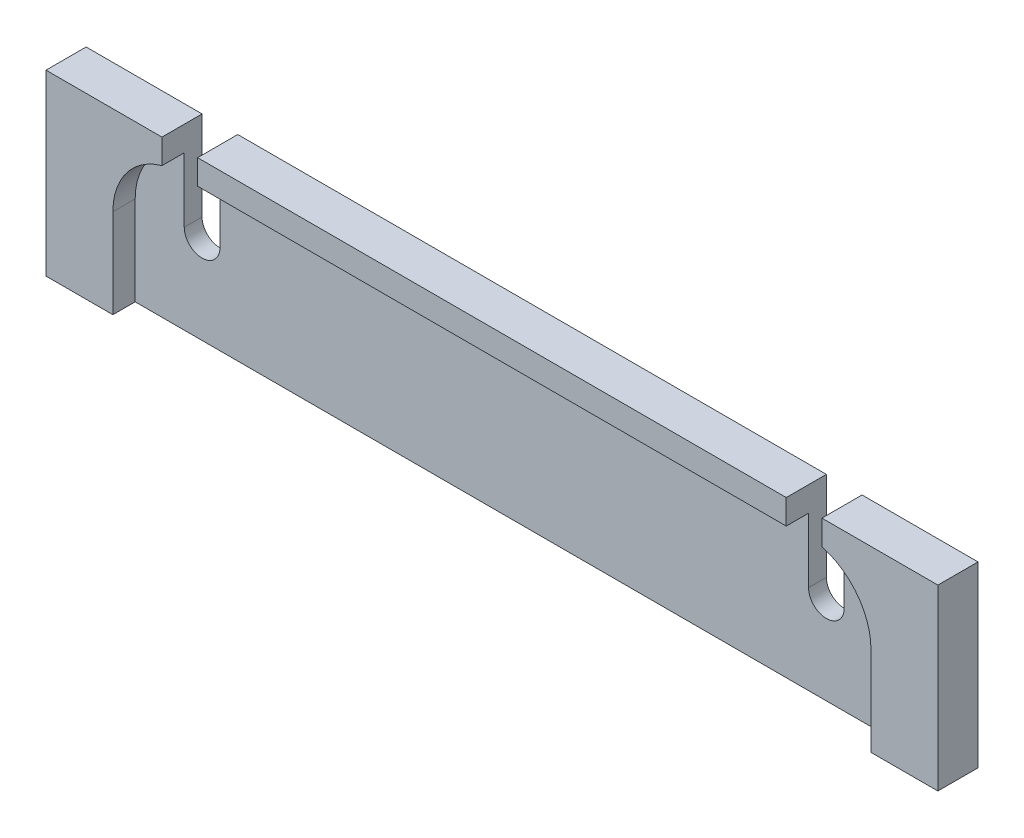
ISO-10303-21;
HEADER;
FILE_DESCRIPTION(('STEP AP214'),'2;1');
FILE_NAME('part.step','',(''),(''),'','','');
FILE_SCHEMA(('AUTOMOTIVE_DESIGN { 1 0 10303 214 1 1 1 1 }'));
ENDSEC;
DATA;
#1=APPLICATION_CONTEXT('core data for automotive mechanical design processes');
#2=APPLICATION_PROTOCOL_DEFINITION('international standard','automotive_design',2000,#1);
#3=PRODUCT_CONTEXT('',#1,'mechanical');
#4=PRODUCT('Part','Part','',(#3));
#5=PRODUCT_RELATED_PRODUCT_CATEGORY('part','',(#4));
#6=PRODUCT_DEFINITION_FORMATION('','',#4);
#7=PRODUCT_DEFINITION_CONTEXT('part definition',#1,'design');
#8=PRODUCT_DEFINITION('design','',#6,#7);
#9=PRODUCT_DEFINITION_SHAPE('','',#8);
#10=(LENGTH_UNIT() NAMED_UNIT(*) SI_UNIT(.MILLI.,.METRE.));
#11=(NAMED_UNIT(*) PLANE_ANGLE_UNIT() SI_UNIT($,.RADIAN.));
#12=(NAMED_UNIT(*) SI_UNIT($,.STERADIAN.) SOLID_ANGLE_UNIT());
#13=UNCERTAINTY_MEASURE_WITH_UNIT(LENGTH_MEASURE(1.E-05),#10,'distance_accuracy_value','');
#14=(GEOMETRIC_REPRESENTATION_CONTEXT(3) GLOBAL_UNCERTAINTY_ASSIGNED_CONTEXT((#13)) GLOBAL_UNIT_ASSIGNED_CONTEXT((#10,
#11,#12)) REPRESENTATION_CONTEXT('',''));
#15=CARTESIAN_POINT('',(0.,0.,0.));
#16=DIRECTION('',(0.,0.,1.));
#17=DIRECTION('',(1.,0.,0.));
#18=AXIS2_PLACEMENT_3D('',#15,#16,#17);
#19=CARTESIAN_POINT('',(-70.,20.,4.));
#20=DIRECTION('',(0.,0.,1.));
#21=DIRECTION('',(1.,0.,0.));
#22=AXIS2_PLACEMENT_3D('',#19,#20,#21);
#23=PLANE('',#22);
#24=DIRECTION('',(0.,-1.,0.));
#25=VECTOR('',#24,1.);
#26=CARTESIAN_POINT('',(85.,0.,4.));
#27=LINE('',#26,#25);
#28=CARTESIAN_POINT('',(85.,20.,4.));
#29=VERTEX_POINT('',#28);
#30=CARTESIAN_POINT('',(85.,0.,4.));
#31=VERTEX_POINT('',#30);
#32=EDGE_CURVE('E55',#29,#31,#27,.T.);
#33=ORIENTED_EDGE('',*,*,#32,.F.);
#34=CARTESIAN_POINT('',(70.,20.,4.));
#35=DIRECTION('',(0.,0.,-1.));
#36=DIRECTION('',(1.,0.,0.));
#37=AXIS2_PLACEMENT_3D('',#34,#35,#36);
#38=CIRCLE('',#37,15.);
#39=CARTESIAN_POINT('',(74.,34.4568322948009,4.));
#40=VERTEX_POINT('',#39);
#41=EDGE_CURVE('E201',#40,#29,#38,.T.);
#42=ORIENTED_EDGE('',*,*,#41,.F.);
#43=DIRECTION('',(0.,-1.,0.));
#44=VECTOR('',#43,1.);
#45=CARTESIAN_POINT('',(74.,20.,4.));
#46=LINE('',#45,#44);
#47=CARTESIAN_POINT('',(74.,20.,4.));
#48=VERTEX_POINT('',#47);
#49=EDGE_CURVE('E279',#40,#48,#46,.T.);
#50=ORIENTED_EDGE('',*,*,#49,.T.);
#51=CARTESIAN_POINT('',(70.,20.,4.));
#52=DIRECTION('',(0.,0.,-1.));
#53=DIRECTION('',(-1.,0.,0.));
#54=AXIS2_PLACEMENT_3D('',#51,#52,#53);
#55=CIRCLE('',#54,4.);
#56=CARTESIAN_POINT('',(66.,20.,4.));
#57=VERTEX_POINT('',#56);
#58=EDGE_CURVE('E283',#48,#57,#55,.T.);
#59=ORIENTED_EDGE('',*,*,#58,.T.);
#60=DIRECTION('',(0.,1.,0.));
#61=VECTOR('',#60,1.);
#62=CARTESIAN_POINT('',(66.,20.,4.));
#63=LINE('',#62,#61);
#64=CARTESIAN_POINT('',(66.,34.4568322948009,4.));
#65=VERTEX_POINT('',#64);
#66=EDGE_CURVE('E286',#57,#65,#63,.T.);
#67=ORIENTED_EDGE('',*,*,#66,.T.);
#68=DIRECTION('',(1.,0.,0.));
#69=VECTOR('',#68,1.);
#70=CARTESIAN_POINT('',(-66.,34.4568322948009,4.));
#71=LINE('',#70,#69);
#72=CARTESIAN_POINT('',(-66.,34.4568322948009,4.));
#73=VERTEX_POINT('',#72);
#74=EDGE_CURVE('E250',#73,#65,#71,.T.);
#75=ORIENTED_EDGE('',*,*,#74,.F.);
#76=DIRECTION('',(0.,-1.,0.));
#77=VECTOR('',#76,1.);
#78=CARTESIAN_POINT('',(-66.,20.,4.));
#79=LINE('',#78,#77);
#80=CARTESIAN_POINT('',(-66.,20.,4.));
#81=VERTEX_POINT('',#80);
#82=EDGE_CURVE('E289',#73,#81,#79,.T.);
#83=ORIENTED_EDGE('',*,*,#82,.T.);
#84=CARTESIAN_POINT('',(-70.,20.,4.));
#85=DIRECTION('',(0.,0.,-1.));
#86=DIRECTION('',(1.,0.,0.));
#87=AXIS2_PLACEMENT_3D('',#84,#85,#86);
#88=CIRCLE('',#87,4.);
#89=CARTESIAN_POINT('',(-74.,20.,4.));
#90=VERTEX_POINT('',#89);
#91=EDGE_CURVE('E292',#81,#90,#88,.T.);
#92=ORIENTED_EDGE('',*,*,#91,.T.);
#93=DIRECTION('',(0.,1.,0.));
#94=VECTOR('',#93,1.);
#95=CARTESIAN_POINT('',(-74.,20.,4.));
#96=LINE('',#95,#94);
#97=CARTESIAN_POINT('',(-74.,34.4568322948009,4.));
#98=VERTEX_POINT('',#97);
#99=EDGE_CURVE('E295',#90,#98,#96,.T.);
#100=ORIENTED_EDGE('',*,*,#99,.T.);
#101=CARTESIAN_POINT('',(-70.,20.,4.));
#102=DIRECTION('',(0.,0.,-1.));
#103=DIRECTION('',(1.,0.,0.));
#104=AXIS2_PLACEMENT_3D('',#101,#102,#103);
#105=CIRCLE('',#104,15.);
#106=CARTESIAN_POINT('',(-85.,20.,4.));
#107=VERTEX_POINT('',#106);
#108=EDGE_CURVE('E208',#107,#98,#105,.T.);
#109=ORIENTED_EDGE('',*,*,#108,.F.);
#110=DIRECTION('',(0.,1.,0.));
#111=VECTOR('',#110,1.);
#112=CARTESIAN_POINT('',(-85.,0.,4.));
#113=LINE('',#112,#111);
#114=CARTESIAN_POINT('',(-85.,0.,4.));
#115=VERTEX_POINT('',#114);
#116=EDGE_CURVE('E203',#115,#107,#113,.T.);
#117=ORIENTED_EDGE('',*,*,#116,.F.);
#118=DIRECTION('',(1.,0.,0.));
#119=VECTOR('',#118,1.);
#120=CARTESIAN_POINT('',(100.,0.,4.));
#121=LINE('',#120,#119);
#122=EDGE_CURVE('E60',#115,#31,#121,.T.);
#123=ORIENTED_EDGE('',*,*,#122,.T.);
#124=EDGE_LOOP('',(#33,#42,#50,#59,#67,#75,#83,#92,#100,#109,#117,#123));
#125=FACE_BOUND('',#124,.T.);
#126=ADVANCED_FACE('F39',(#125),#23,.T.);
#127=CARTESIAN_POINT('',(-100.,40.,4.));
#128=DIRECTION('',(0.,-1.,0.));
#129=DIRECTION('',(0.,0.,-1.));
#130=AXIS2_PLACEMENT_3D('',#127,#128,#129);
#131=PLANE('',#130);
#132=DIRECTION('',(-1.,0.,0.));
#133=VECTOR('',#132,1.);
#134=CARTESIAN_POINT('',(-100.,40.,0.));
#135=LINE('',#134,#133);
#136=CARTESIAN_POINT('',(-74.,40.,0.));
#137=VERTEX_POINT('',#136);
#138=CARTESIAN_POINT('',(-100.,40.,0.));
#139=VERTEX_POINT('',#138);
#140=EDGE_CURVE('E276',#137,#139,#135,.T.);
#141=ORIENTED_EDGE('',*,*,#140,.T.);
#142=DIRECTION('',(0.,0.,-1.));
#143=VECTOR('',#142,1.);
#144=CARTESIAN_POINT('',(-100.,40.,4.));
#145=LINE('',#144,#143);
#146=CARTESIAN_POINT('',(-100.,40.,9.));
#147=VERTEX_POINT('',#146);
#148=EDGE_CURVE('E11',#147,#139,#145,.T.);
#149=ORIENTED_EDGE('',*,*,#148,.F.);
#150=DIRECTION('',(-1.,0.,0.));
#151=VECTOR('',#150,1.);
#152=CARTESIAN_POINT('',(-74.,40.,9.));
#153=LINE('',#152,#151);
#154=CARTESIAN_POINT('',(-74.,40.,9.));
#155=VERTEX_POINT('',#154);
#156=EDGE_CURVE('E214',#155,#147,#153,.T.);
#157=ORIENTED_EDGE('',*,*,#156,.F.);
#158=DIRECTION('',(0.,0.,-1.));
#159=VECTOR('',#158,1.);
#160=CARTESIAN_POINT('',(-74.,40.,4.));
#161=LINE('',#160,#159);
#162=EDGE_CURVE('E298',#155,#137,#161,.T.);
#163=ORIENTED_EDGE('',*,*,#162,.T.);
#164=EDGE_LOOP('',(#141,#149,#157,#163));
#165=FACE_BOUND('',#164,.T.);
#166=ADVANCED_FACE('F41',(#165),#131,.F.);
#167=CARTESIAN_POINT('',(-100.,0.,4.));
#168=DIRECTION('',(1.,0.,0.));
#169=DIRECTION('',(0.,0.,-1.));
#170=AXIS2_PLACEMENT_3D('',#167,#168,#169);
#171=PLANE('',#170);
#172=DIRECTION('',(0.,-1.,0.));
#173=VECTOR('',#172,1.);
#174=CARTESIAN_POINT('',(-100.,0.,0.));
#175=LINE('',#174,#173);
#176=CARTESIAN_POINT('',(-100.,0.,0.));
#177=VERTEX_POINT('',#176);
#178=EDGE_CURVE('E302',#139,#177,#175,.T.);
#179=ORIENTED_EDGE('',*,*,#178,.T.);
#180=DIRECTION('',(0.,0.,-1.));
#181=VECTOR('',#180,1.);
#182=CARTESIAN_POINT('',(-100.,0.,4.));
#183=LINE('',#182,#181);
#184=CARTESIAN_POINT('',(-100.,0.,9.));
#185=VERTEX_POINT('',#184);
#186=EDGE_CURVE('E48',#185,#177,#183,.T.);
#187=ORIENTED_EDGE('',*,*,#186,.F.);
#188=DIRECTION('',(0.,-1.,0.));
#189=VECTOR('',#188,1.);
#190=CARTESIAN_POINT('',(-100.,40.,9.));
#191=LINE('',#190,#189);
#192=EDGE_CURVE('E218',#147,#185,#191,.T.);
#193=ORIENTED_EDGE('',*,*,#192,.F.);
#194=ORIENTED_EDGE('',*,*,#148,.T.);
#195=EDGE_LOOP('',(#179,#187,#193,#194));
#196=FACE_BOUND('',#195,.T.);
#197=ADVANCED_FACE('F417',(#196),#171,.F.);
#198=CARTESIAN_POINT('',(100.,0.,4.));
#199=DIRECTION('',(0.,1.,0.));
#200=DIRECTION('',(0.,0.,1.));
#201=AXIS2_PLACEMENT_3D('',#198,#199,#200);
#202=PLANE('',#201);
#203=DIRECTION('',(1.,0.,0.));
#204=VECTOR('',#203,1.);
#205=CARTESIAN_POINT('',(100.,0.,0.));
#206=LINE('',#205,#204);
#207=CARTESIAN_POINT('',(100.,0.,0.));
#208=VERTEX_POINT('',#207);
#209=EDGE_CURVE('E305',#177,#208,#206,.T.);
#210=ORIENTED_EDGE('',*,*,#209,.T.);
#211=DIRECTION('',(0.,0.,-1.));
#212=VECTOR('',#211,1.);
#213=CARTESIAN_POINT('',(100.,0.,4.));
#214=LINE('',#213,#212);
#215=CARTESIAN_POINT('',(100.,0.,9.));
#216=VERTEX_POINT('',#215);
#217=EDGE_CURVE('E369',#216,#208,#214,.T.);
#218=ORIENTED_EDGE('',*,*,#217,.F.);
#219=DIRECTION('',(1.,0.,0.));
#220=VECTOR('',#219,1.);
#221=CARTESIAN_POINT('',(100.,0.,9.));
#222=LINE('',#221,#220);
#223=CARTESIAN_POINT('',(85.,0.,9.));
#224=VERTEX_POINT('',#223);
#225=EDGE_CURVE('E187',#224,#216,#222,.T.);
#226=ORIENTED_EDGE('',*,*,#225,.F.);
#227=DIRECTION('',(0.,0.,-1.));
#228=VECTOR('',#227,1.);
#229=CARTESIAN_POINT('',(85.,0.,9.));
#230=LINE('',#229,#228);
#231=EDGE_CURVE('E182',#224,#31,#230,.T.);
#232=ORIENTED_EDGE('',*,*,#231,.T.);
#233=ORIENTED_EDGE('',*,*,#122,.F.);
#234=DIRECTION('',(0.,0.,-1.));
#235=VECTOR('',#234,1.);
#236=CARTESIAN_POINT('',(-85.,0.,9.));
#237=LINE('',#236,#235);
#238=CARTESIAN_POINT('',(-85.,0.,9.));
#239=VERTEX_POINT('',#238);
#240=EDGE_CURVE('E246',#239,#115,#237,.T.);
#241=ORIENTED_EDGE('',*,*,#240,.F.);
#242=DIRECTION('',(1.,0.,0.));
#243=VECTOR('',#242,1.);
#244=CARTESIAN_POINT('',(-100.,0.,9.));
#245=LINE('',#244,#243);
#246=EDGE_CURVE('E222',#185,#239,#245,.T.);
#247=ORIENTED_EDGE('',*,*,#246,.F.);
#248=ORIENTED_EDGE('',*,*,#186,.T.);
#249=EDGE_LOOP('',(#210,#218,#226,#232,#233,#241,#247,#248));
#250=FACE_BOUND('',#249,.T.);
#251=ADVANCED_FACE('F377',(#250),#202,.F.);
#252=CARTESIAN_POINT('',(100.,0.,4.));
#253=DIRECTION('',(-1.,0.,0.));
#254=DIRECTION('',(0.,0.,1.));
#255=AXIS2_PLACEMENT_3D('',#252,#253,#254);
#256=PLANE('',#255);
#257=DIRECTION('',(0.,1.,0.));
#258=VECTOR('',#257,1.);
#259=CARTESIAN_POINT('',(100.,0.,0.));
#260=LINE('',#259,#258);
#261=CARTESIAN_POINT('',(100.,40.,0.));
#262=VERTEX_POINT('',#261);
#263=EDGE_CURVE('E308',#208,#262,#260,.T.);
#264=ORIENTED_EDGE('',*,*,#263,.T.);
#265=DIRECTION('',(0.,0.,-1.));
#266=VECTOR('',#265,1.);
#267=CARTESIAN_POINT('',(100.,40.,4.));
#268=LINE('',#267,#266);
#269=CARTESIAN_POINT('',(100.,40.,9.));
#270=VERTEX_POINT('',#269);
#271=EDGE_CURVE('E365',#270,#262,#268,.T.);
#272=ORIENTED_EDGE('',*,*,#271,.F.);
#273=DIRECTION('',(0.,1.,0.));
#274=VECTOR('',#273,1.);
#275=CARTESIAN_POINT('',(100.,40.,9.));
#276=LINE('',#275,#274);
#277=EDGE_CURVE('E396',#216,#270,#276,.T.);
#278=ORIENTED_EDGE('',*,*,#277,.F.);
#279=ORIENTED_EDGE('',*,*,#217,.T.);
#280=EDGE_LOOP('',(#264,#272,#278,#279));
#281=FACE_BOUND('',#280,.T.);
#282=ADVANCED_FACE('F388',(#281),#256,.F.);
#283=CARTESIAN_POINT('',(100.,40.,4.));
#284=DIRECTION('',(0.,-1.,0.));
#285=DIRECTION('',(0.,0.,-1.));
#286=AXIS2_PLACEMENT_3D('',#283,#284,#285);
#287=PLANE('',#286);
#288=DIRECTION('',(-1.,0.,0.));
#289=VECTOR('',#288,1.);
#290=CARTESIAN_POINT('',(100.,40.,0.));
#291=LINE('',#290,#289);
#292=CARTESIAN_POINT('',(74.,40.,0.));
#293=VERTEX_POINT('',#292);
#294=EDGE_CURVE('E311',#262,#293,#291,.T.);
#295=ORIENTED_EDGE('',*,*,#294,.T.);
#296=DIRECTION('',(0.,0.,-1.));
#297=VECTOR('',#296,1.);
#298=CARTESIAN_POINT('',(74.,40.,4.));
#299=LINE('',#298,#297);
#300=CARTESIAN_POINT('',(74.,40.,9.));
#301=VERTEX_POINT('',#300);
#302=EDGE_CURVE('E361',#301,#293,#299,.T.);
#303=ORIENTED_EDGE('',*,*,#302,.F.);
#304=DIRECTION('',(-1.,0.,0.));
#305=VECTOR('',#304,1.);
#306=CARTESIAN_POINT('',(74.,40.,9.));
#307=LINE('',#306,#305);
#308=EDGE_CURVE('E394',#270,#301,#307,.T.);
#309=ORIENTED_EDGE('',*,*,#308,.F.);
#310=ORIENTED_EDGE('',*,*,#271,.T.);
#311=EDGE_LOOP('',(#295,#303,#309,#310));
#312=FACE_BOUND('',#311,.T.);
#313=ADVANCED_FACE('F393',(#312),#287,.F.);
#314=CARTESIAN_POINT('',(74.,20.,4.));
#315=DIRECTION('',(1.,0.,0.));
#316=DIRECTION('',(0.,0.,-1.));
#317=AXIS2_PLACEMENT_3D('',#314,#315,#316);
#318=PLANE('',#317);
#319=DIRECTION('',(0.,-1.,0.));
#320=VECTOR('',#319,1.);
#321=CARTESIAN_POINT('',(74.,20.,0.));
#322=LINE('',#321,#320);
#323=CARTESIAN_POINT('',(74.,20.,0.));
#324=VERTEX_POINT('',#323);
#325=EDGE_CURVE('E314',#293,#324,#322,.T.);
#326=ORIENTED_EDGE('',*,*,#325,.T.);
#327=DIRECTION('',(0.,0.,-1.));
#328=VECTOR('',#327,1.);
#329=CARTESIAN_POINT('',(74.,20.,4.));
#330=LINE('',#329,#328);
#331=EDGE_CURVE('E357',#48,#324,#330,.T.);
#332=ORIENTED_EDGE('',*,*,#331,.F.);
#333=ORIENTED_EDGE('',*,*,#49,.F.);
#334=DIRECTION('',(0.,0.,-1.));
#335=VECTOR('',#334,1.);
#336=CARTESIAN_POINT('',(74.,34.4568322948009,9.));
#337=LINE('',#336,#335);
#338=CARTESIAN_POINT('',(74.,34.4568322948009,9.));
#339=VERTEX_POINT('',#338);
#340=EDGE_CURVE('E210',#339,#40,#337,.T.);
#341=ORIENTED_EDGE('',*,*,#340,.F.);
#342=DIRECTION('',(0.,-1.,0.));
#343=VECTOR('',#342,1.);
#344=CARTESIAN_POINT('',(74.,40.,9.));
#345=LINE('',#344,#343);
#346=EDGE_CURVE('E194',#301,#339,#345,.T.);
#347=ORIENTED_EDGE('',*,*,#346,.F.);
#348=ORIENTED_EDGE('',*,*,#302,.T.);
#349=EDGE_LOOP('',(#326,#332,#333,#341,#347,#348));
#350=FACE_BOUND('',#349,.T.);
#351=ADVANCED_FACE('F409',(#350),#318,.F.);
#352=CARTESIAN_POINT('',(70.,20.,4.));
#353=DIRECTION('',(0.,0.,-1.));
#354=DIRECTION('',(-1.,0.,0.));
#355=AXIS2_PLACEMENT_3D('',#352,#353,#354);
#356=CYLINDRICAL_SURFACE('',#355,4.);
#357=CARTESIAN_POINT('',(70.,20.,0.));
#358=DIRECTION('',(0.,0.,-1.));
#359=DIRECTION('',(-1.,0.,0.));
#360=AXIS2_PLACEMENT_3D('',#357,#358,#359);
#361=CIRCLE('',#360,4.);
#362=CARTESIAN_POINT('',(66.,20.,0.));
#363=VERTEX_POINT('',#362);
#364=EDGE_CURVE('E317',#324,#363,#361,.T.);
#365=ORIENTED_EDGE('',*,*,#364,.T.);
#366=DIRECTION('',(0.,0.,-1.));
#367=VECTOR('',#366,1.);
#368=CARTESIAN_POINT('',(66.,20.,4.));
#369=LINE('',#368,#367);
#370=EDGE_CURVE('E353',#57,#363,#369,.T.);
#371=ORIENTED_EDGE('',*,*,#370,.F.);
#372=ORIENTED_EDGE('',*,*,#58,.F.);
#373=ORIENTED_EDGE('',*,*,#331,.T.);
#374=EDGE_LOOP('',(#365,#371,#372,#373));
#375=FACE_BOUND('',#374,.T.);
#376=ADVANCED_FACE('F444',(#375),#356,.F.);
#377=CARTESIAN_POINT('',(66.,20.,4.));
#378=DIRECTION('',(-1.,0.,0.));
#379=DIRECTION('',(0.,0.,1.));
#380=AXIS2_PLACEMENT_3D('',#377,#378,#379);
#381=PLANE('',#380);
#382=DIRECTION('',(0.,1.,0.));
#383=VECTOR('',#382,1.);
#384=CARTESIAN_POINT('',(66.,20.,0.));
#385=LINE('',#384,#383);
#386=CARTESIAN_POINT('',(66.,40.,0.));
#387=VERTEX_POINT('',#386);
#388=EDGE_CURVE('E320',#363,#387,#385,.T.);
#389=ORIENTED_EDGE('',*,*,#388,.T.);
#390=DIRECTION('',(0.,0.,-1.));
#391=VECTOR('',#390,1.);
#392=CARTESIAN_POINT('',(66.,40.,4.));
#393=LINE('',#392,#391);
#394=CARTESIAN_POINT('',(66.,40.,9.));
#395=VERTEX_POINT('',#394);
#396=EDGE_CURVE('E349',#395,#387,#393,.T.);
#397=ORIENTED_EDGE('',*,*,#396,.F.);
#398=DIRECTION('',(0.,1.,0.));
#399=VECTOR('',#398,1.);
#400=CARTESIAN_POINT('',(66.,34.4568322948009,9.));
#401=LINE('',#400,#399);
#402=CARTESIAN_POINT('',(66.,34.4568322948009,9.));
#403=VERTEX_POINT('',#402);
#404=EDGE_CURVE('E261',#403,#395,#401,.T.);
#405=ORIENTED_EDGE('',*,*,#404,.F.);
#406=DIRECTION('',(0.,0.,-1.));
#407=VECTOR('',#406,1.);
#408=CARTESIAN_POINT('',(66.,34.4568322948009,9.));
#409=LINE('',#408,#407);
#410=EDGE_CURVE('E265',#403,#65,#409,.T.);
#411=ORIENTED_EDGE('',*,*,#410,.T.);
#412=ORIENTED_EDGE('',*,*,#66,.F.);
#413=ORIENTED_EDGE('',*,*,#370,.T.);
#414=EDGE_LOOP('',(#389,#397,#405,#411,#412,#413));
#415=FACE_BOUND('',#414,.T.);
#416=ADVANCED_FACE('F440',(#415),#381,.F.);
#417=CARTESIAN_POINT('',(-66.,40.,4.));
#418=DIRECTION('',(0.,-1.,0.));
#419=DIRECTION('',(0.,0.,-1.));
#420=AXIS2_PLACEMENT_3D('',#417,#418,#419);
#421=PLANE('',#420);
#422=DIRECTION('',(-1.,0.,0.));
#423=VECTOR('',#422,1.);
#424=CARTESIAN_POINT('',(-66.,40.,0.));
#425=LINE('',#424,#423);
#426=CARTESIAN_POINT('',(-66.,40.,0.));
#427=VERTEX_POINT('',#426);
#428=EDGE_CURVE('E323',#387,#427,#425,.T.);
#429=ORIENTED_EDGE('',*,*,#428,.T.);
#430=DIRECTION('',(0.,0.,-1.));
#431=VECTOR('',#430,1.);
#432=CARTESIAN_POINT('',(-66.,40.,4.));
#433=LINE('',#432,#431);
#434=CARTESIAN_POINT('',(-66.,40.,9.));
#435=VERTEX_POINT('',#434);
#436=EDGE_CURVE('E345',#435,#427,#433,.T.);
#437=ORIENTED_EDGE('',*,*,#436,.F.);
#438=DIRECTION('',(-1.,0.,0.));
#439=VECTOR('',#438,1.);
#440=CARTESIAN_POINT('',(66.,40.,9.));
#441=LINE('',#440,#439);
#442=EDGE_CURVE('E251',#395,#435,#441,.T.);
#443=ORIENTED_EDGE('',*,*,#442,.F.);
#444=ORIENTED_EDGE('',*,*,#396,.T.);
#445=EDGE_LOOP('',(#429,#437,#443,#444));
#446=FACE_BOUND('',#445,.T.);
#447=ADVANCED_FACE('F436',(#446),#421,.F.);
#448=CARTESIAN_POINT('',(-66.,20.,4.));
#449=DIRECTION('',(1.,0.,0.));
#450=DIRECTION('',(0.,0.,-1.));
#451=AXIS2_PLACEMENT_3D('',#448,#449,#450);
#452=PLANE('',#451);
#453=DIRECTION('',(0.,-1.,0.));
#454=VECTOR('',#453,1.);
#455=CARTESIAN_POINT('',(-66.,20.,0.));
#456=LINE('',#455,#454);
#457=CARTESIAN_POINT('',(-66.,20.,0.));
#458=VERTEX_POINT('',#457);
#459=EDGE_CURVE('E326',#427,#458,#456,.T.);
#460=ORIENTED_EDGE('',*,*,#459,.T.);
#461=DIRECTION('',(0.,0.,-1.));
#462=VECTOR('',#461,1.);
#463=CARTESIAN_POINT('',(-66.,20.,4.));
#464=LINE('',#463,#462);
#465=EDGE_CURVE('E341',#81,#458,#464,.T.);
#466=ORIENTED_EDGE('',*,*,#465,.F.);
#467=ORIENTED_EDGE('',*,*,#82,.F.);
#468=DIRECTION('',(0.,0.,-1.));
#469=VECTOR('',#468,1.);
#470=CARTESIAN_POINT('',(-66.,34.4568322948009,9.));
#471=LINE('',#470,#469);
#472=CARTESIAN_POINT('',(-66.,34.4568322948009,9.));
#473=VERTEX_POINT('',#472);
#474=EDGE_CURVE('E272',#473,#73,#471,.T.);
#475=ORIENTED_EDGE('',*,*,#474,.F.);
#476=DIRECTION('',(0.,-1.,0.));
#477=VECTOR('',#476,1.);
#478=CARTESIAN_POINT('',(-66.,40.,9.));
#479=LINE('',#478,#477);
#480=EDGE_CURVE('E255',#435,#473,#479,.T.);
#481=ORIENTED_EDGE('',*,*,#480,.F.);
#482=ORIENTED_EDGE('',*,*,#436,.T.);
#483=EDGE_LOOP('',(#460,#466,#467,#475,#481,#482));
#484=FACE_BOUND('',#483,.T.);
#485=ADVANCED_FACE('F432',(#484),#452,.F.);
#486=CARTESIAN_POINT('',(-70.,20.,4.));
#487=DIRECTION('',(0.,0.,-1.));
#488=DIRECTION('',(-1.,0.,0.));
#489=AXIS2_PLACEMENT_3D('',#486,#487,#488);
#490=CYLINDRICAL_SURFACE('',#489,4.);
#491=CARTESIAN_POINT('',(-70.,20.,0.));
#492=DIRECTION('',(0.,0.,-1.));
#493=DIRECTION('',(1.,0.,0.));
#494=AXIS2_PLACEMENT_3D('',#491,#492,#493);
#495=CIRCLE('',#494,4.);
#496=CARTESIAN_POINT('',(-74.,20.,0.));
#497=VERTEX_POINT('',#496);
#498=EDGE_CURVE('E329',#458,#497,#495,.T.);
#499=ORIENTED_EDGE('',*,*,#498,.T.);
#500=DIRECTION('',(0.,0.,-1.));
#501=VECTOR('',#500,1.);
#502=CARTESIAN_POINT('',(-74.,20.,4.));
#503=LINE('',#502,#501);
#504=EDGE_CURVE('E337',#90,#497,#503,.T.);
#505=ORIENTED_EDGE('',*,*,#504,.F.);
#506=ORIENTED_EDGE('',*,*,#91,.F.);
#507=ORIENTED_EDGE('',*,*,#465,.T.);
#508=EDGE_LOOP('',(#499,#505,#506,#507));
#509=FACE_BOUND('',#508,.T.);
#510=ADVANCED_FACE('F428',(#509),#490,.F.);
#511=CARTESIAN_POINT('',(-74.,20.,4.));
#512=DIRECTION('',(-1.,0.,0.));
#513=DIRECTION('',(0.,0.,1.));
#514=AXIS2_PLACEMENT_3D('',#511,#512,#513);
#515=PLANE('',#514);
#516=DIRECTION('',(0.,1.,0.));
#517=VECTOR('',#516,1.);
#518=CARTESIAN_POINT('',(-74.,20.,0.));
#519=LINE('',#518,#517);
#520=EDGE_CURVE('E280',#497,#137,#519,.T.);
#521=ORIENTED_EDGE('',*,*,#520,.T.);
#522=ORIENTED_EDGE('',*,*,#162,.F.);
#523=DIRECTION('',(0.,1.,0.));
#524=VECTOR('',#523,1.);
#525=CARTESIAN_POINT('',(-74.,34.4568322948009,9.));
#526=LINE('',#525,#524);
#527=CARTESIAN_POINT('',(-74.,34.4568322948009,9.));
#528=VERTEX_POINT('',#527);
#529=EDGE_CURVE('E231',#528,#155,#526,.T.);
#530=ORIENTED_EDGE('',*,*,#529,.F.);
#531=DIRECTION('',(0.,0.,-1.));
#532=VECTOR('',#531,1.);
#533=CARTESIAN_POINT('',(-74.,34.4568322948009,9.));
#534=LINE('',#533,#532);
#535=EDGE_CURVE('E234',#528,#98,#534,.T.);
#536=ORIENTED_EDGE('',*,*,#535,.T.);
#537=ORIENTED_EDGE('',*,*,#99,.F.);
#538=ORIENTED_EDGE('',*,*,#504,.T.);
#539=EDGE_LOOP('',(#521,#522,#530,#536,#537,#538));
#540=FACE_BOUND('',#539,.T.);
#541=ADVANCED_FACE('F425',(#540),#515,.F.);
#542=CARTESIAN_POINT('',(-70.,20.,0.));
#543=DIRECTION('',(0.,0.,1.));
#544=DIRECTION('',(1.,0.,0.));
#545=AXIS2_PLACEMENT_3D('',#542,#543,#544);
#546=PLANE('',#545);
#547=ORIENTED_EDGE('',*,*,#140,.F.);
#548=ORIENTED_EDGE('',*,*,#520,.F.);
#549=ORIENTED_EDGE('',*,*,#498,.F.);
#550=ORIENTED_EDGE('',*,*,#459,.F.);
#551=ORIENTED_EDGE('',*,*,#428,.F.);
#552=ORIENTED_EDGE('',*,*,#388,.F.);
#553=ORIENTED_EDGE('',*,*,#364,.F.);
#554=ORIENTED_EDGE('',*,*,#325,.F.);
#555=ORIENTED_EDGE('',*,*,#294,.F.);
#556=ORIENTED_EDGE('',*,*,#263,.F.);
#557=ORIENTED_EDGE('',*,*,#209,.F.);
#558=ORIENTED_EDGE('',*,*,#178,.F.);
#559=EDGE_LOOP('',(#547,#548,#549,#550,#551,#552,#553,#554,#555,#556,#557,#558));
#560=FACE_BOUND('',#559,.T.);
#561=ADVANCED_FACE('F384',(#560),#546,.F.);
#562=CARTESIAN_POINT('',(-66.,34.4568322948009,9.));
#563=DIRECTION('',(0.,1.,0.));
#564=DIRECTION('',(0.,0.,1.));
#565=AXIS2_PLACEMENT_3D('',#562,#563,#564);
#566=PLANE('',#565);
#567=ORIENTED_EDGE('',*,*,#74,.T.);
#568=ORIENTED_EDGE('',*,*,#410,.F.);
#569=DIRECTION('',(1.,0.,0.));
#570=VECTOR('',#569,1.);
#571=CARTESIAN_POINT('',(-66.,34.4568322948009,9.));
#572=LINE('',#571,#570);
#573=EDGE_CURVE('E258',#473,#403,#572,.T.);
#574=ORIENTED_EDGE('',*,*,#573,.F.);
#575=ORIENTED_EDGE('',*,*,#474,.T.);
#576=EDGE_LOOP('',(#567,#568,#574,#575));
#577=FACE_BOUND('',#576,.T.);
#578=ADVANCED_FACE('F421',(#577),#566,.F.);
#579=CARTESIAN_POINT('',(0.,0.,9.));
#580=DIRECTION('',(0.,0.,1.));
#581=DIRECTION('',(1.,0.,0.));
#582=AXIS2_PLACEMENT_3D('',#579,#580,#581);
#583=PLANE('',#582);
#584=ORIENTED_EDGE('',*,*,#442,.T.);
#585=ORIENTED_EDGE('',*,*,#480,.T.);
#586=ORIENTED_EDGE('',*,*,#573,.T.);
#587=ORIENTED_EDGE('',*,*,#404,.T.);
#588=EDGE_LOOP('',(#584,#585,#586,#587));
#589=FACE_BOUND('',#588,.T.);
#590=ADVANCED_FACE('F477',(#589),#583,.T.);
#591=CARTESIAN_POINT('',(-85.,0.,9.));
#592=DIRECTION('',(-1.,0.,0.));
#593=DIRECTION('',(0.,0.,1.));
#594=AXIS2_PLACEMENT_3D('',#591,#592,#593);
#595=PLANE('',#594);
#596=ORIENTED_EDGE('',*,*,#116,.T.);
#597=DIRECTION('',(0.,0.,-1.));
#598=VECTOR('',#597,1.);
#599=CARTESIAN_POINT('',(-85.,20.,9.));
#600=LINE('',#599,#598);
#601=CARTESIAN_POINT('',(-85.,20.,9.));
#602=VERTEX_POINT('',#601);
#603=EDGE_CURVE('E242',#602,#107,#600,.T.);
#604=ORIENTED_EDGE('',*,*,#603,.F.);
#605=DIRECTION('',(0.,1.,0.));
#606=VECTOR('',#605,1.);
#607=CARTESIAN_POINT('',(-85.,0.,9.));
#608=LINE('',#607,#606);
#609=EDGE_CURVE('E225',#239,#602,#608,.T.);
#610=ORIENTED_EDGE('',*,*,#609,.F.);
#611=ORIENTED_EDGE('',*,*,#240,.T.);
#612=EDGE_LOOP('',(#596,#604,#610,#611));
#613=FACE_BOUND('',#612,.T.);
#614=ADVANCED_FACE('F492',(#613),#595,.F.);
#615=CARTESIAN_POINT('',(-70.,20.,9.));
#616=DIRECTION('',(0.,0.,-1.));
#617=DIRECTION('',(-1.,0.,0.));
#618=AXIS2_PLACEMENT_3D('',#615,#616,#617);
#619=CYLINDRICAL_SURFACE('',#618,15.);
#620=ORIENTED_EDGE('',*,*,#108,.T.);
#621=ORIENTED_EDGE('',*,*,#535,.F.);
#622=CARTESIAN_POINT('',(-70.,20.,9.));
#623=DIRECTION('',(0.,0.,-1.));
#624=DIRECTION('',(1.,0.,0.));
#625=AXIS2_PLACEMENT_3D('',#622,#623,#624);
#626=CIRCLE('',#625,15.);
#627=EDGE_CURVE('E228',#602,#528,#626,.T.);
#628=ORIENTED_EDGE('',*,*,#627,.F.);
#629=ORIENTED_EDGE('',*,*,#603,.T.);
#630=EDGE_LOOP('',(#620,#621,#628,#629));
#631=FACE_BOUND('',#630,.T.);
#632=ADVANCED_FACE('F485',(#631),#619,.F.);
#633=CARTESIAN_POINT('',(-70.,20.,9.));
#634=DIRECTION('',(0.,0.,1.));
#635=DIRECTION('',(1.,0.,0.));
#636=AXIS2_PLACEMENT_3D('',#633,#634,#635);
#637=PLANE('',#636);
#638=ORIENTED_EDGE('',*,*,#156,.T.);
#639=ORIENTED_EDGE('',*,*,#192,.T.);
#640=ORIENTED_EDGE('',*,*,#246,.T.);
#641=ORIENTED_EDGE('',*,*,#609,.T.);
#642=ORIENTED_EDGE('',*,*,#627,.T.);
#643=ORIENTED_EDGE('',*,*,#529,.T.);
#644=EDGE_LOOP('',(#638,#639,#640,#641,#642,#643));
#645=FACE_BOUND('',#644,.T.);
#646=ADVANCED_FACE('F489',(#645),#637,.T.);
#647=CARTESIAN_POINT('',(70.,20.,9.));
#648=DIRECTION('',(0.,0.,-1.));
#649=DIRECTION('',(-1.,0.,0.));
#650=AXIS2_PLACEMENT_3D('',#647,#648,#649);
#651=CYLINDRICAL_SURFACE('',#650,15.);
#652=ORIENTED_EDGE('',*,*,#41,.T.);
#653=DIRECTION('',(0.,0.,-1.));
#654=VECTOR('',#653,1.);
#655=CARTESIAN_POINT('',(85.,20.,9.));
#656=LINE('',#655,#654);
#657=CARTESIAN_POINT('',(85.,20.,9.));
#658=VERTEX_POINT('',#657);
#659=EDGE_CURVE('E179',#658,#29,#656,.T.);
#660=ORIENTED_EDGE('',*,*,#659,.F.);
#661=CARTESIAN_POINT('',(70.,20.,9.));
#662=DIRECTION('',(0.,0.,-1.));
#663=DIRECTION('',(1.,0.,0.));
#664=AXIS2_PLACEMENT_3D('',#661,#662,#663);
#665=CIRCLE('',#664,15.);
#666=EDGE_CURVE('E188',#339,#658,#665,.T.);
#667=ORIENTED_EDGE('',*,*,#666,.F.);
#668=ORIENTED_EDGE('',*,*,#340,.T.);
#669=EDGE_LOOP('',(#652,#660,#667,#668));
#670=FACE_BOUND('',#669,.T.);
#671=ADVANCED_FACE('F200',(#670),#651,.F.);
#672=CARTESIAN_POINT('',(85.,0.,9.));
#673=DIRECTION('',(1.,0.,0.));
#674=DIRECTION('',(0.,1.,0.));
#675=AXIS2_PLACEMENT_3D('',#672,#673,#674);
#676=PLANE('',#675);
#677=ORIENTED_EDGE('',*,*,#32,.T.);
#678=ORIENTED_EDGE('',*,*,#231,.F.);
#679=DIRECTION('',(0.,-1.,0.));
#680=VECTOR('',#679,1.);
#681=CARTESIAN_POINT('',(85.,0.,9.));
#682=LINE('',#681,#680);
#683=EDGE_CURVE('E175',#658,#224,#682,.T.);
#684=ORIENTED_EDGE('',*,*,#683,.F.);
#685=ORIENTED_EDGE('',*,*,#659,.T.);
#686=EDGE_LOOP('',(#677,#678,#684,#685));
#687=FACE_BOUND('',#686,.T.);
#688=ADVANCED_FACE('F177',(#687),#676,.F.);
#689=CARTESIAN_POINT('',(70.,20.,9.));
#690=DIRECTION('',(0.,0.,1.));
#691=DIRECTION('',(1.,0.,0.));
#692=AXIS2_PLACEMENT_3D('',#689,#690,#691);
#693=PLANE('',#692);
#694=ORIENTED_EDGE('',*,*,#666,.T.);
#695=ORIENTED_EDGE('',*,*,#683,.T.);
#696=ORIENTED_EDGE('',*,*,#225,.T.);
#697=ORIENTED_EDGE('',*,*,#277,.T.);
#698=ORIENTED_EDGE('',*,*,#308,.T.);
#699=ORIENTED_EDGE('',*,*,#346,.T.);
#700=EDGE_LOOP('',(#694,#695,#696,#697,#698,#699));
#701=FACE_BOUND('',#700,.T.);
#702=ADVANCED_FACE('F191',(#701),#693,.T.);
#703=CLOSED_SHELL('',(#126,#166,#197,#251,#282,#313,#351,#376,#416,#447,#485,#510,#541,#561,
#578,#590,#614,#632,#646,#671,#688,#702));
#704=MANIFOLD_SOLID_BREP('B2',#703);
#705=ADVANCED_BREP_SHAPE_REPRESENTATION('',(#18,#704),#14);
#706=SHAPE_DEFINITION_REPRESENTATION(#9,#705);
ENDSEC;
END-ISO-10303-21;
